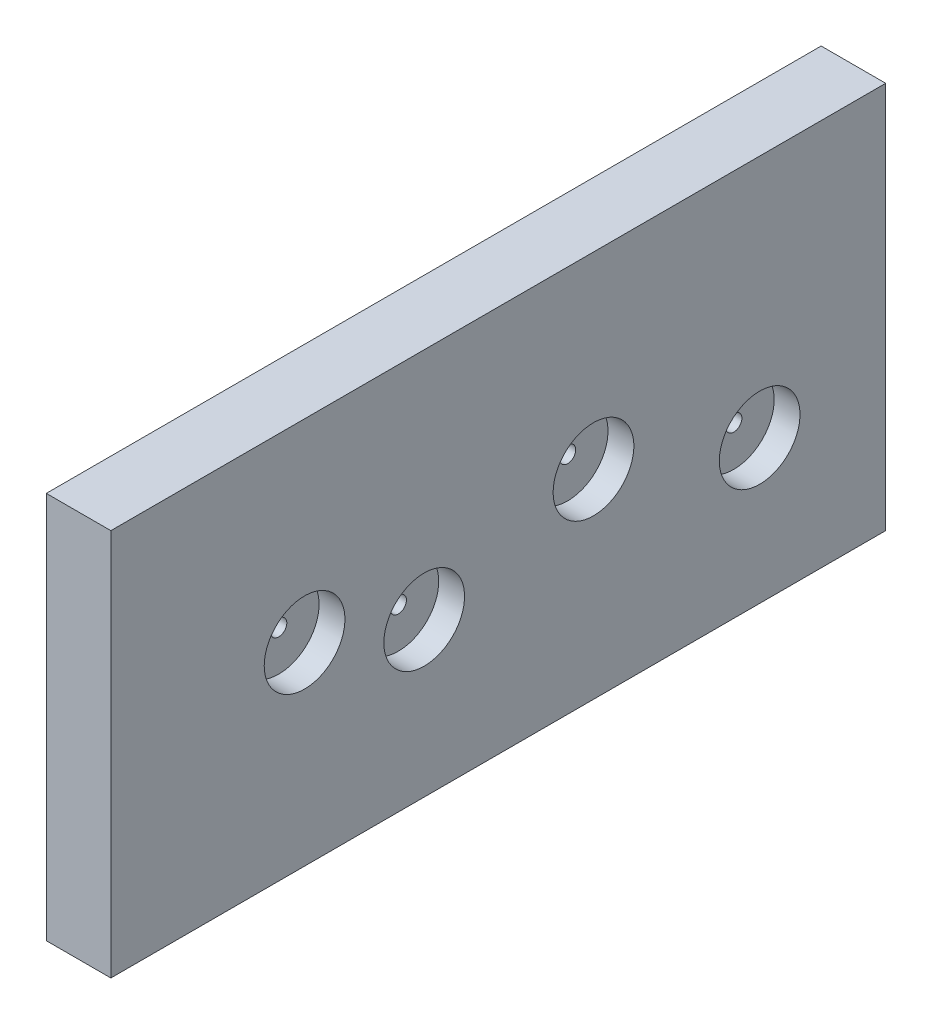
ISO-10303-21;
HEADER;
FILE_DESCRIPTION(('STEP AP214'),'2;1');
FILE_NAME('part.step','',(''),(''),'','','');
FILE_SCHEMA(('AUTOMOTIVE_DESIGN { 1 0 10303 214 1 1 1 1 }'));
ENDSEC;
DATA;
#1=APPLICATION_CONTEXT('core data for automotive mechanical design processes');
#2=APPLICATION_PROTOCOL_DEFINITION('international standard','automotive_design',2000,#1);
#3=PRODUCT_CONTEXT('',#1,'mechanical');
#4=PRODUCT('Part','Part','',(#3));
#5=PRODUCT_RELATED_PRODUCT_CATEGORY('part','',(#4));
#6=PRODUCT_DEFINITION_FORMATION('','',#4);
#7=PRODUCT_DEFINITION_CONTEXT('part definition',#1,'design');
#8=PRODUCT_DEFINITION('design','',#6,#7);
#9=PRODUCT_DEFINITION_SHAPE('','',#8);
#10=(LENGTH_UNIT() NAMED_UNIT(*) SI_UNIT(.MILLI.,.METRE.));
#11=(NAMED_UNIT(*) PLANE_ANGLE_UNIT() SI_UNIT($,.RADIAN.));
#12=(NAMED_UNIT(*) SI_UNIT($,.STERADIAN.) SOLID_ANGLE_UNIT());
#13=UNCERTAINTY_MEASURE_WITH_UNIT(LENGTH_MEASURE(1.E-05),#10,'distance_accuracy_value','');
#14=(GEOMETRIC_REPRESENTATION_CONTEXT(3) GLOBAL_UNCERTAINTY_ASSIGNED_CONTEXT((#13)) GLOBAL_UNIT_ASSIGNED_CONTEXT((#10,
#11,#12)) REPRESENTATION_CONTEXT('',''));
#15=CARTESIAN_POINT('',(0.,0.,0.));
#16=DIRECTION('',(0.,0.,1.));
#17=DIRECTION('',(1.,0.,0.));
#18=AXIS2_PLACEMENT_3D('',#15,#16,#17);
#19=CARTESIAN_POINT('',(12.7,-38.1,0.));
#20=DIRECTION('',(0.,1.,0.));
#21=DIRECTION('',(0.,0.,1.));
#22=AXIS2_PLACEMENT_3D('',#19,#20,#21);
#23=PLANE('',#22);
#24=CARTESIAN_POINT('',(6.35000000000001,-38.1,0.));
#25=DIRECTION('',(0.,-1.,0.));
#26=DIRECTION('',(0.,0.,-1.));
#27=AXIS2_PLACEMENT_3D('',#24,#25,#26);
#28=CIRCLE('',#27,3.175);
#29=CARTESIAN_POINT('',(6.35000000000001,-38.1,-3.175));
#30=VERTEX_POINT('',#29);
#31=EDGE_CURVE('E115',#30,#30,#28,.T.);
#32=ORIENTED_EDGE('',*,*,#31,.F.);
#33=EDGE_LOOP('',(#32));
#34=FACE_BOUND('',#33,.T.);
#35=CARTESIAN_POINT('',(6.35,-38.1,57.15));
#36=DIRECTION('',(0.,-1.,0.));
#37=DIRECTION('',(0.,0.,-1.));
#38=AXIS2_PLACEMENT_3D('',#35,#36,#37);
#39=CIRCLE('',#38,3.175);
#40=CARTESIAN_POINT('',(6.35,-38.1,53.975));
#41=VERTEX_POINT('',#40);
#42=EDGE_CURVE('E114',#41,#41,#39,.T.);
#43=ORIENTED_EDGE('',*,*,#42,.F.);
#44=EDGE_LOOP('',(#43));
#45=FACE_BOUND('',#44,.T.);
#46=DIRECTION('',(0.,0.,-1.));
#47=VECTOR('',#46,1.);
#48=CARTESIAN_POINT('',(0.,-38.1,0.));
#49=LINE('',#48,#47);
#50=CARTESIAN_POINT('',(0.,-38.1,76.2));
#51=VERTEX_POINT('',#50);
#52=CARTESIAN_POINT('',(0.,-38.1,-76.2));
#53=VERTEX_POINT('',#52);
#54=EDGE_CURVE('E182',#51,#53,#49,.T.);
#55=ORIENTED_EDGE('',*,*,#54,.T.);
#56=DIRECTION('',(-1.,0.,0.));
#57=VECTOR('',#56,1.);
#58=CARTESIAN_POINT('',(12.7,-38.1,-76.2));
#59=LINE('',#58,#57);
#60=CARTESIAN_POINT('',(12.7,-38.1,-76.2));
#61=VERTEX_POINT('',#60);
#62=EDGE_CURVE('E11',#61,#53,#59,.T.);
#63=ORIENTED_EDGE('',*,*,#62,.F.);
#64=DIRECTION('',(0.,0.,-1.));
#65=VECTOR('',#64,1.);
#66=CARTESIAN_POINT('',(12.7,-38.1,0.));
#67=LINE('',#66,#65);
#68=CARTESIAN_POINT('',(12.7,-38.1,76.2));
#69=VERTEX_POINT('',#68);
#70=EDGE_CURVE('E169',#69,#61,#67,.T.);
#71=ORIENTED_EDGE('',*,*,#70,.F.);
#72=DIRECTION('',(-1.,0.,0.));
#73=VECTOR('',#72,1.);
#74=CARTESIAN_POINT('',(12.7,-38.1,76.2));
#75=LINE('',#74,#73);
#76=EDGE_CURVE('E66',#69,#51,#75,.T.);
#77=ORIENTED_EDGE('',*,*,#76,.T.);
#78=EDGE_LOOP('',(#55,#63,#71,#77));
#79=FACE_BOUND('',#78,.T.);
#80=CARTESIAN_POINT('',(6.35000000000002,-38.1,-63.5));
#81=DIRECTION('',(0.,-1.,0.));
#82=DIRECTION('',(0.,0.,-1.));
#83=AXIS2_PLACEMENT_3D('',#80,#81,#82);
#84=CIRCLE('',#83,3.175);
#85=CARTESIAN_POINT('',(6.35000000000002,-38.1,-66.675));
#86=VERTEX_POINT('',#85);
#87=EDGE_CURVE('E128',#86,#86,#84,.T.);
#88=ORIENTED_EDGE('',*,*,#87,.F.);
#89=EDGE_LOOP('',(#88));
#90=FACE_BOUND('',#89,.T.);
#91=ADVANCED_FACE('F47',(#34,#45,#79,#90),#23,.F.);
#92=CARTESIAN_POINT('',(12.7,0.,-76.2));
#93=DIRECTION('',(0.,0.,1.));
#94=DIRECTION('',(1.,0.,0.));
#95=AXIS2_PLACEMENT_3D('',#92,#93,#94);
#96=PLANE('',#95);
#97=DIRECTION('',(0.,1.,0.));
#98=VECTOR('',#97,1.);
#99=CARTESIAN_POINT('',(0.,0.,-76.2));
#100=LINE('',#99,#98);
#101=CARTESIAN_POINT('',(0.,38.1,-76.2));
#102=VERTEX_POINT('',#101);
#103=EDGE_CURVE('E185',#53,#102,#100,.T.);
#104=ORIENTED_EDGE('',*,*,#103,.T.);
#105=DIRECTION('',(-1.,0.,0.));
#106=VECTOR('',#105,1.);
#107=CARTESIAN_POINT('',(12.7,38.1,-76.2));
#108=LINE('',#107,#106);
#109=CARTESIAN_POINT('',(12.7,38.1,-76.2));
#110=VERTEX_POINT('',#109);
#111=EDGE_CURVE('E57',#110,#102,#108,.T.);
#112=ORIENTED_EDGE('',*,*,#111,.F.);
#113=DIRECTION('',(0.,1.,0.));
#114=VECTOR('',#113,1.);
#115=CARTESIAN_POINT('',(12.7,0.,-76.2));
#116=LINE('',#115,#114);
#117=EDGE_CURVE('E92',#61,#110,#116,.T.);
#118=ORIENTED_EDGE('',*,*,#117,.F.);
#119=ORIENTED_EDGE('',*,*,#62,.T.);
#120=EDGE_LOOP('',(#104,#112,#118,#119));
#121=FACE_BOUND('',#120,.T.);
#122=ADVANCED_FACE('F269',(#121),#96,.F.);
#123=CARTESIAN_POINT('',(12.7,38.1,0.));
#124=DIRECTION('',(0.,1.,0.));
#125=DIRECTION('',(0.,0.,1.));
#126=AXIS2_PLACEMENT_3D('',#123,#124,#125);
#127=PLANE('',#126);
#128=DIRECTION('',(0.,0.,-1.));
#129=VECTOR('',#128,1.);
#130=CARTESIAN_POINT('',(0.,38.1,0.));
#131=LINE('',#130,#129);
#132=CARTESIAN_POINT('',(0.,38.1,76.2));
#133=VERTEX_POINT('',#132);
#134=EDGE_CURVE('E189',#133,#102,#131,.T.);
#135=ORIENTED_EDGE('',*,*,#134,.F.);
#136=DIRECTION('',(-1.,0.,0.));
#137=VECTOR('',#136,1.);
#138=CARTESIAN_POINT('',(12.7,38.1,76.2));
#139=LINE('',#138,#137);
#140=CARTESIAN_POINT('',(12.7,38.1,76.2));
#141=VERTEX_POINT('',#140);
#142=EDGE_CURVE('E81',#141,#133,#139,.T.);
#143=ORIENTED_EDGE('',*,*,#142,.F.);
#144=DIRECTION('',(0.,0.,-1.));
#145=VECTOR('',#144,1.);
#146=CARTESIAN_POINT('',(12.7,38.1,0.));
#147=LINE('',#146,#145);
#148=EDGE_CURVE('E175',#141,#110,#147,.T.);
#149=ORIENTED_EDGE('',*,*,#148,.T.);
#150=ORIENTED_EDGE('',*,*,#111,.T.);
#151=EDGE_LOOP('',(#135,#143,#149,#150));
#152=FACE_BOUND('',#151,.T.);
#153=ADVANCED_FACE('F240',(#152),#127,.T.);
#154=CARTESIAN_POINT('',(12.7,-9.873506971,-51.4082559918149));
#155=DIRECTION('',(-1.,0.,0.));
#156=DIRECTION('',(0.,0.,1.));
#157=AXIS2_PLACEMENT_3D('',#154,#155,#156);
#158=CYLINDRICAL_SURFACE('',#157,1.5875);
#159=CARTESIAN_POINT('',(7.62,-9.873506971,-51.4082559918149));
#160=DIRECTION('',(-1.,0.,0.));
#161=DIRECTION('',(0.,0.,1.));
#162=AXIS2_PLACEMENT_3D('',#159,#160,#161);
#163=CIRCLE('',#162,1.5875);
#164=CARTESIAN_POINT('',(7.62,-9.873506971,-49.8207559918149));
#165=VERTEX_POINT('',#164);
#166=EDGE_CURVE('E50',#165,#165,#163,.T.);
#167=ORIENTED_EDGE('',*,*,#166,.F.);
#168=EDGE_LOOP('',(#167));
#169=FACE_BOUND('',#168,.T.);
#170=CARTESIAN_POINT('',(0.,-9.873506971,-51.4082559918149));
#171=DIRECTION('',(1.,0.,0.));
#172=DIRECTION('',(0.,0.,-1.));
#173=AXIS2_PLACEMENT_3D('',#170,#171,#172);
#174=CIRCLE('',#173,1.5875);
#175=CARTESIAN_POINT('',(0.,-9.873506971,-52.9957559918149));
#176=VERTEX_POINT('',#175);
#177=EDGE_CURVE('E205',#176,#176,#174,.T.);
#178=ORIENTED_EDGE('',*,*,#177,.F.);
#179=EDGE_LOOP('',(#178));
#180=FACE_BOUND('',#179,.T.);
#181=ADVANCED_FACE('F236',(#169,#180),#158,.F.);
#182=CARTESIAN_POINT('',(12.7,1.096077429,-18.7225315801618));
#183=DIRECTION('',(-1.,0.,0.));
#184=DIRECTION('',(0.,0.,1.));
#185=AXIS2_PLACEMENT_3D('',#182,#183,#184);
#186=CYLINDRICAL_SURFACE('',#185,1.5875);
#187=CARTESIAN_POINT('',(7.62,1.096077429,-18.7225315801618));
#188=DIRECTION('',(-1.,0.,0.));
#189=DIRECTION('',(0.,0.,1.));
#190=AXIS2_PLACEMENT_3D('',#187,#188,#189);
#191=CIRCLE('',#190,1.5875);
#192=CARTESIAN_POINT('',(7.62,1.096077429,-17.1350315801618));
#193=VERTEX_POINT('',#192);
#194=EDGE_CURVE('E224',#193,#193,#191,.T.);
#195=ORIENTED_EDGE('',*,*,#194,.F.);
#196=EDGE_LOOP('',(#195));
#197=FACE_BOUND('',#196,.T.);
#198=CARTESIAN_POINT('',(0.,1.096077429,-18.7225315801618));
#199=DIRECTION('',(1.,0.,0.));
#200=DIRECTION('',(0.,0.,-1.));
#201=AXIS2_PLACEMENT_3D('',#198,#199,#200);
#202=CIRCLE('',#201,1.5875);
#203=CARTESIAN_POINT('',(0.,1.096077429,-20.3100315801618));
#204=VERTEX_POINT('',#203);
#205=EDGE_CURVE('E201',#204,#204,#202,.T.);
#206=ORIENTED_EDGE('',*,*,#205,.F.);
#207=EDGE_LOOP('',(#206));
#208=FACE_BOUND('',#207,.T.);
#209=ADVANCED_FACE('F239',(#197,#208),#186,.F.);
#210=CARTESIAN_POINT('',(12.7,0.,38.1));
#211=DIRECTION('',(-1.,0.,0.));
#212=DIRECTION('',(0.,0.,1.));
#213=AXIS2_PLACEMENT_3D('',#210,#211,#212);
#214=CYLINDRICAL_SURFACE('',#213,1.5875);
#215=CARTESIAN_POINT('',(7.62,0.,38.1));
#216=DIRECTION('',(-1.,0.,0.));
#217=DIRECTION('',(0.,0.,1.));
#218=AXIS2_PLACEMENT_3D('',#215,#216,#217);
#219=CIRCLE('',#218,1.5875);
#220=CARTESIAN_POINT('',(7.62,0.,39.6875));
#221=VERTEX_POINT('',#220);
#222=EDGE_CURVE('E221',#221,#221,#219,.T.);
#223=ORIENTED_EDGE('',*,*,#222,.F.);
#224=EDGE_LOOP('',(#223));
#225=FACE_BOUND('',#224,.T.);
#226=CARTESIAN_POINT('',(0.,0.,38.1));
#227=DIRECTION('',(1.,0.,0.));
#228=DIRECTION('',(0.,0.,-1.));
#229=AXIS2_PLACEMENT_3D('',#226,#227,#228);
#230=CIRCLE('',#229,1.5875);
#231=CARTESIAN_POINT('',(0.,0.,36.5125));
#232=VERTEX_POINT('',#231);
#233=EDGE_CURVE('E197',#232,#232,#230,.T.);
#234=ORIENTED_EDGE('',*,*,#233,.F.);
#235=EDGE_LOOP('',(#234));
#236=FACE_BOUND('',#235,.T.);
#237=ADVANCED_FACE('F265',(#225,#236),#214,.F.);
#238=CARTESIAN_POINT('',(12.7,0.,76.2));
#239=DIRECTION('',(0.,0.,1.));
#240=DIRECTION('',(1.,0.,0.));
#241=AXIS2_PLACEMENT_3D('',#238,#239,#240);
#242=PLANE('',#241);
#243=DIRECTION('',(0.,1.,0.));
#244=VECTOR('',#243,1.);
#245=CARTESIAN_POINT('',(0.,0.,76.2));
#246=LINE('',#245,#244);
#247=EDGE_CURVE('E193',#51,#133,#246,.T.);
#248=ORIENTED_EDGE('',*,*,#247,.F.);
#249=ORIENTED_EDGE('',*,*,#76,.F.);
#250=DIRECTION('',(0.,1.,0.));
#251=VECTOR('',#250,1.);
#252=CARTESIAN_POINT('',(12.7,0.,76.2));
#253=LINE('',#252,#251);
#254=EDGE_CURVE('E179',#69,#141,#253,.T.);
#255=ORIENTED_EDGE('',*,*,#254,.T.);
#256=ORIENTED_EDGE('',*,*,#142,.T.);
#257=EDGE_LOOP('',(#248,#249,#255,#256));
#258=FACE_BOUND('',#257,.T.);
#259=ADVANCED_FACE('F255',(#258),#242,.T.);
#260=CARTESIAN_POINT('',(12.7,-7.860160654,14.5712240149026));
#261=DIRECTION('',(-1.,0.,0.));
#262=DIRECTION('',(0.,0.,1.));
#263=AXIS2_PLACEMENT_3D('',#260,#261,#262);
#264=CYLINDRICAL_SURFACE('',#263,1.5875);
#265=CARTESIAN_POINT('',(7.62,-7.860160654,14.5712240149026));
#266=DIRECTION('',(-1.,0.,0.));
#267=DIRECTION('',(0.,0.,1.));
#268=AXIS2_PLACEMENT_3D('',#265,#266,#267);
#269=CIRCLE('',#268,1.5875);
#270=CARTESIAN_POINT('',(7.62,-7.860160654,16.1587240149026));
#271=VERTEX_POINT('',#270);
#272=EDGE_CURVE('E141',#271,#271,#269,.T.);
#273=ORIENTED_EDGE('',*,*,#272,.F.);
#274=EDGE_LOOP('',(#273));
#275=FACE_BOUND('',#274,.T.);
#276=CARTESIAN_POINT('',(0.,-7.860160654,14.5712240149026));
#277=DIRECTION('',(1.,0.,0.));
#278=DIRECTION('',(0.,0.,-1.));
#279=AXIS2_PLACEMENT_3D('',#276,#277,#278);
#280=CIRCLE('',#279,1.5875);
#281=CARTESIAN_POINT('',(0.,-7.860160654,12.9837240149026));
#282=VERTEX_POINT('',#281);
#283=EDGE_CURVE('E172',#282,#282,#280,.T.);
#284=ORIENTED_EDGE('',*,*,#283,.F.);
#285=EDGE_LOOP('',(#284));
#286=FACE_BOUND('',#285,.T.);
#287=ADVANCED_FACE('F253',(#275,#286),#264,.F.);
#288=CARTESIAN_POINT('',(12.7,0.,0.));
#289=DIRECTION('',(1.,0.,0.));
#290=DIRECTION('',(0.,0.,-1.));
#291=AXIS2_PLACEMENT_3D('',#288,#289,#290);
#292=PLANE('',#291);
#293=CARTESIAN_POINT('',(12.7,0.,38.1));
#294=DIRECTION('',(-1.,0.,0.));
#295=DIRECTION('',(0.,0.,1.));
#296=AXIS2_PLACEMENT_3D('',#293,#294,#295);
#297=CIRCLE('',#296,7.9375);
#298=CARTESIAN_POINT('',(12.7,0.,46.0375));
#299=VERTEX_POINT('',#298);
#300=EDGE_CURVE('E142',#299,#299,#297,.T.);
#301=ORIENTED_EDGE('',*,*,#300,.T.);
#302=EDGE_LOOP('',(#301));
#303=FACE_BOUND('',#302,.T.);
#304=CARTESIAN_POINT('',(12.7,-7.860160654,14.5712240149026));
#305=DIRECTION('',(-1.,0.,0.));
#306=DIRECTION('',(0.,0.,1.));
#307=AXIS2_PLACEMENT_3D('',#304,#305,#306);
#308=CIRCLE('',#307,7.9375);
#309=CARTESIAN_POINT('',(12.7,-7.860160654,22.5087240149026));
#310=VERTEX_POINT('',#309);
#311=EDGE_CURVE('E146',#310,#310,#308,.T.);
#312=ORIENTED_EDGE('',*,*,#311,.T.);
#313=EDGE_LOOP('',(#312));
#314=FACE_BOUND('',#313,.T.);
#315=CARTESIAN_POINT('',(12.7,1.096077429,-18.7225315801618));
#316=DIRECTION('',(-1.,0.,0.));
#317=DIRECTION('',(0.,0.,1.));
#318=AXIS2_PLACEMENT_3D('',#315,#316,#317);
#319=CIRCLE('',#318,7.9375);
#320=CARTESIAN_POINT('',(12.7,1.096077429,-10.7850315801618));
#321=VERTEX_POINT('',#320);
#322=EDGE_CURVE('E154',#321,#321,#319,.T.);
#323=ORIENTED_EDGE('',*,*,#322,.T.);
#324=EDGE_LOOP('',(#323));
#325=FACE_BOUND('',#324,.T.);
#326=CARTESIAN_POINT('',(12.7,-9.873506971,-51.4082559918149));
#327=DIRECTION('',(-1.,0.,0.));
#328=DIRECTION('',(0.,0.,1.));
#329=AXIS2_PLACEMENT_3D('',#326,#327,#328);
#330=CIRCLE('',#329,7.9375);
#331=CARTESIAN_POINT('',(12.7,-9.873506971,-43.4707559918149));
#332=VERTEX_POINT('',#331);
#333=EDGE_CURVE('E162',#332,#332,#330,.T.);
#334=ORIENTED_EDGE('',*,*,#333,.T.);
#335=EDGE_LOOP('',(#334));
#336=FACE_BOUND('',#335,.T.);
#337=ORIENTED_EDGE('',*,*,#70,.T.);
#338=ORIENTED_EDGE('',*,*,#117,.T.);
#339=ORIENTED_EDGE('',*,*,#148,.F.);
#340=ORIENTED_EDGE('',*,*,#254,.F.);
#341=EDGE_LOOP('',(#337,#338,#339,#340));
#342=FACE_BOUND('',#341,.T.);
#343=ADVANCED_FACE('F248',(#303,#314,#325,#336,#342),#292,.T.);
#344=CARTESIAN_POINT('',(0.,0.,0.));
#345=DIRECTION('',(1.,0.,0.));
#346=DIRECTION('',(0.,0.,-1.));
#347=AXIS2_PLACEMENT_3D('',#344,#345,#346);
#348=PLANE('',#347);
#349=ORIENTED_EDGE('',*,*,#54,.F.);
#350=ORIENTED_EDGE('',*,*,#247,.T.);
#351=ORIENTED_EDGE('',*,*,#134,.T.);
#352=ORIENTED_EDGE('',*,*,#103,.F.);
#353=EDGE_LOOP('',(#349,#350,#351,#352));
#354=FACE_BOUND('',#353,.T.);
#355=ORIENTED_EDGE('',*,*,#233,.T.);
#356=EDGE_LOOP('',(#355));
#357=FACE_BOUND('',#356,.T.);
#358=ORIENTED_EDGE('',*,*,#205,.T.);
#359=EDGE_LOOP('',(#358));
#360=FACE_BOUND('',#359,.T.);
#361=ORIENTED_EDGE('',*,*,#177,.T.);
#362=EDGE_LOOP('',(#361));
#363=FACE_BOUND('',#362,.T.);
#364=ORIENTED_EDGE('',*,*,#283,.T.);
#365=EDGE_LOOP('',(#364));
#366=FACE_BOUND('',#365,.T.);
#367=ADVANCED_FACE('F244',(#354,#357,#360,#363,#366),#348,.F.);
#368=CARTESIAN_POINT('',(7.62,-9.873506971,-51.4082559918149));
#369=DIRECTION('',(1.,0.,0.));
#370=DIRECTION('',(0.,0.,-1.));
#371=AXIS2_PLACEMENT_3D('',#368,#369,#370);
#372=CYLINDRICAL_SURFACE('',#371,7.9375);
#373=CARTESIAN_POINT('',(7.62,-9.873506971,-51.4082559918149));
#374=DIRECTION('',(-1.,0.,0.));
#375=DIRECTION('',(0.,0.,1.));
#376=AXIS2_PLACEMENT_3D('',#373,#374,#375);
#377=CIRCLE('',#376,7.9375);
#378=CARTESIAN_POINT('',(7.62,-9.873506971,-43.4707559918149));
#379=VERTEX_POINT('',#378);
#380=EDGE_CURVE('E136',#379,#379,#377,.T.);
#381=ORIENTED_EDGE('',*,*,#380,.T.);
#382=EDGE_LOOP('',(#381));
#383=FACE_BOUND('',#382,.T.);
#384=ORIENTED_EDGE('',*,*,#333,.F.);
#385=EDGE_LOOP('',(#384));
#386=FACE_BOUND('',#385,.T.);
#387=ADVANCED_FACE('F247',(#383,#386),#372,.F.);
#388=CARTESIAN_POINT('',(7.62,-9.873506971,-51.4082559918149));
#389=DIRECTION('',(-1.,0.,0.));
#390=DIRECTION('',(0.,0.,1.));
#391=AXIS2_PLACEMENT_3D('',#388,#389,#390);
#392=PLANE('',#391);
#393=ORIENTED_EDGE('',*,*,#166,.T.);
#394=EDGE_LOOP('',(#393));
#395=FACE_BOUND('',#394,.T.);
#396=ORIENTED_EDGE('',*,*,#380,.F.);
#397=EDGE_LOOP('',(#396));
#398=FACE_BOUND('',#397,.T.);
#399=ADVANCED_FACE('F233',(#395,#398),#392,.F.);
#400=CARTESIAN_POINT('',(7.62,1.096077429,-18.7225315801618));
#401=DIRECTION('',(1.,0.,0.));
#402=DIRECTION('',(0.,0.,-1.));
#403=AXIS2_PLACEMENT_3D('',#400,#401,#402);
#404=CYLINDRICAL_SURFACE('',#403,7.9375);
#405=CARTESIAN_POINT('',(7.62,1.096077429,-18.7225315801618));
#406=DIRECTION('',(-1.,0.,0.));
#407=DIRECTION('',(0.,0.,1.));
#408=AXIS2_PLACEMENT_3D('',#405,#406,#407);
#409=CIRCLE('',#408,7.9375);
#410=CARTESIAN_POINT('',(7.62,1.096077429,-10.7850315801618));
#411=VERTEX_POINT('',#410);
#412=EDGE_CURVE('E158',#411,#411,#409,.T.);
#413=ORIENTED_EDGE('',*,*,#412,.T.);
#414=EDGE_LOOP('',(#413));
#415=FACE_BOUND('',#414,.T.);
#416=ORIENTED_EDGE('',*,*,#322,.F.);
#417=EDGE_LOOP('',(#416));
#418=FACE_BOUND('',#417,.T.);
#419=ADVANCED_FACE('F315',(#415,#418),#404,.F.);
#420=CARTESIAN_POINT('',(7.62,1.096077429,-18.7225315801618));
#421=DIRECTION('',(-1.,0.,0.));
#422=DIRECTION('',(0.,0.,1.));
#423=AXIS2_PLACEMENT_3D('',#420,#421,#422);
#424=PLANE('',#423);
#425=ORIENTED_EDGE('',*,*,#194,.T.);
#426=EDGE_LOOP('',(#425));
#427=FACE_BOUND('',#426,.T.);
#428=ORIENTED_EDGE('',*,*,#412,.F.);
#429=EDGE_LOOP('',(#428));
#430=FACE_BOUND('',#429,.T.);
#431=ADVANCED_FACE('F310',(#427,#430),#424,.F.);
#432=CARTESIAN_POINT('',(7.62,-7.860160654,14.5712240149026));
#433=DIRECTION('',(1.,0.,0.));
#434=DIRECTION('',(0.,0.,-1.));
#435=AXIS2_PLACEMENT_3D('',#432,#433,#434);
#436=CYLINDRICAL_SURFACE('',#435,7.9375);
#437=CARTESIAN_POINT('',(7.62,-7.860160654,14.5712240149026));
#438=DIRECTION('',(-1.,0.,0.));
#439=DIRECTION('',(0.,0.,1.));
#440=AXIS2_PLACEMENT_3D('',#437,#438,#439);
#441=CIRCLE('',#440,7.9375);
#442=CARTESIAN_POINT('',(7.62,-7.860160654,22.5087240149026));
#443=VERTEX_POINT('',#442);
#444=EDGE_CURVE('E150',#443,#443,#441,.T.);
#445=ORIENTED_EDGE('',*,*,#444,.T.);
#446=EDGE_LOOP('',(#445));
#447=FACE_BOUND('',#446,.T.);
#448=ORIENTED_EDGE('',*,*,#311,.F.);
#449=EDGE_LOOP('',(#448));
#450=FACE_BOUND('',#449,.T.);
#451=ADVANCED_FACE('F307',(#447,#450),#436,.F.);
#452=CARTESIAN_POINT('',(7.62,-7.860160654,14.5712240149026));
#453=DIRECTION('',(-1.,0.,0.));
#454=DIRECTION('',(0.,0.,1.));
#455=AXIS2_PLACEMENT_3D('',#452,#453,#454);
#456=PLANE('',#455);
#457=ORIENTED_EDGE('',*,*,#272,.T.);
#458=EDGE_LOOP('',(#457));
#459=FACE_BOUND('',#458,.T.);
#460=ORIENTED_EDGE('',*,*,#444,.F.);
#461=EDGE_LOOP('',(#460));
#462=FACE_BOUND('',#461,.T.);
#463=ADVANCED_FACE('F305',(#459,#462),#456,.F.);
#464=CARTESIAN_POINT('',(7.62,0.,38.1));
#465=DIRECTION('',(1.,0.,0.));
#466=DIRECTION('',(0.,0.,-1.));
#467=AXIS2_PLACEMENT_3D('',#464,#465,#466);
#468=CYLINDRICAL_SURFACE('',#467,7.9375);
#469=CARTESIAN_POINT('',(7.62,0.,38.1));
#470=DIRECTION('',(-1.,0.,0.));
#471=DIRECTION('',(0.,0.,1.));
#472=AXIS2_PLACEMENT_3D('',#469,#470,#471);
#473=CIRCLE('',#472,7.9375);
#474=CARTESIAN_POINT('',(7.62,0.,46.0375));
#475=VERTEX_POINT('',#474);
#476=EDGE_CURVE('E137',#475,#475,#473,.T.);
#477=ORIENTED_EDGE('',*,*,#476,.T.);
#478=EDGE_LOOP('',(#477));
#479=FACE_BOUND('',#478,.T.);
#480=ORIENTED_EDGE('',*,*,#300,.F.);
#481=EDGE_LOOP('',(#480));
#482=FACE_BOUND('',#481,.T.);
#483=ADVANCED_FACE('F301',(#479,#482),#468,.F.);
#484=CARTESIAN_POINT('',(7.62,0.,38.1));
#485=DIRECTION('',(-1.,0.,0.));
#486=DIRECTION('',(0.,0.,1.));
#487=AXIS2_PLACEMENT_3D('',#484,#485,#486);
#488=PLANE('',#487);
#489=ORIENTED_EDGE('',*,*,#222,.T.);
#490=EDGE_LOOP('',(#489));
#491=FACE_BOUND('',#490,.T.);
#492=ORIENTED_EDGE('',*,*,#476,.F.);
#493=EDGE_LOOP('',(#492));
#494=FACE_BOUND('',#493,.T.);
#495=ADVANCED_FACE('F294',(#491,#494),#488,.F.);
#496=CARTESIAN_POINT('',(6.35000000000002,0.,-63.5));
#497=DIRECTION('',(0.,-1.,0.));
#498=DIRECTION('',(0.,0.,-1.));
#499=AXIS2_PLACEMENT_3D('',#496,#497,#498);
#500=CONICAL_SURFACE('',#499,3.17499999999999,1.02974425867665);
#501=CARTESIAN_POINT('',(6.35000000000001,1.9077324654125,-63.5));
#502=VERTEX_POINT('',#501);
#503=VERTEX_LOOP('',#502);
#504=FACE_BOUND('',#503,.T.);
#505=CARTESIAN_POINT('',(6.35000000000002,0.,-63.5));
#506=DIRECTION('',(0.,-1.,0.));
#507=DIRECTION('',(0.,0.,-1.));
#508=AXIS2_PLACEMENT_3D('',#505,#506,#507);
#509=CIRCLE('',#508,3.17499999999999);
#510=CARTESIAN_POINT('',(6.35000000000002,0.,-66.675));
#511=VERTEX_POINT('',#510);
#512=EDGE_CURVE('E132',#511,#511,#509,.T.);
#513=ORIENTED_EDGE('',*,*,#512,.T.);
#514=EDGE_LOOP('',(#513));
#515=FACE_BOUND('',#514,.T.);
#516=ADVANCED_FACE('F286',(#504,#515),#500,.F.);
#517=CARTESIAN_POINT('',(6.35000000000002,-38.1,-63.5));
#518=DIRECTION('',(0.,-1.,0.));
#519=DIRECTION('',(0.,0.,-1.));
#520=AXIS2_PLACEMENT_3D('',#517,#518,#519);
#521=CYLINDRICAL_SURFACE('',#520,3.17499999999999);
#522=ORIENTED_EDGE('',*,*,#512,.F.);
#523=EDGE_LOOP('',(#522));
#524=FACE_BOUND('',#523,.T.);
#525=ORIENTED_EDGE('',*,*,#87,.T.);
#526=EDGE_LOOP('',(#525));
#527=FACE_BOUND('',#526,.T.);
#528=ADVANCED_FACE('F283',(#524,#527),#521,.F.);
#529=CARTESIAN_POINT('',(6.35,0.,57.15));
#530=DIRECTION('',(0.,-1.,0.));
#531=DIRECTION('',(0.,0.,-1.));
#532=AXIS2_PLACEMENT_3D('',#529,#530,#531);
#533=CONICAL_SURFACE('',#532,3.17499999999999,1.02974425867665);
#534=CARTESIAN_POINT('',(6.34999999999999,1.9077324654125,57.15));
#535=VERTEX_POINT('',#534);
#536=VERTEX_LOOP('',#535);
#537=FACE_BOUND('',#536,.T.);
#538=CARTESIAN_POINT('',(6.35,0.,57.15));
#539=DIRECTION('',(0.,-1.,0.));
#540=DIRECTION('',(0.,0.,-1.));
#541=AXIS2_PLACEMENT_3D('',#538,#539,#540);
#542=CIRCLE('',#541,3.17499999999999);
#543=CARTESIAN_POINT('',(6.35,0.,53.975));
#544=VERTEX_POINT('',#543);
#545=EDGE_CURVE('E120',#544,#544,#542,.T.);
#546=ORIENTED_EDGE('',*,*,#545,.T.);
#547=EDGE_LOOP('',(#546));
#548=FACE_BOUND('',#547,.T.);
#549=ADVANCED_FACE('F285',(#537,#548),#533,.F.);
#550=CARTESIAN_POINT('',(6.35,-38.1,57.15));
#551=DIRECTION('',(0.,-1.,0.));
#552=DIRECTION('',(0.,0.,-1.));
#553=AXIS2_PLACEMENT_3D('',#550,#551,#552);
#554=CYLINDRICAL_SURFACE('',#553,3.175);
#555=ORIENTED_EDGE('',*,*,#545,.F.);
#556=EDGE_LOOP('',(#555));
#557=FACE_BOUND('',#556,.T.);
#558=ORIENTED_EDGE('',*,*,#42,.T.);
#559=EDGE_LOOP('',(#558));
#560=FACE_BOUND('',#559,.T.);
#561=ADVANCED_FACE('F107',(#557,#560),#554,.F.);
#562=CARTESIAN_POINT('',(6.35000000000001,0.,0.));
#563=DIRECTION('',(0.,-1.,0.));
#564=DIRECTION('',(0.,0.,-1.));
#565=AXIS2_PLACEMENT_3D('',#562,#563,#564);
#566=CONICAL_SURFACE('',#565,3.17499999999999,1.02974425867665);
#567=CARTESIAN_POINT('',(6.35,1.9077324654125,0.));
#568=VERTEX_POINT('',#567);
#569=VERTEX_LOOP('',#568);
#570=FACE_BOUND('',#569,.T.);
#571=CARTESIAN_POINT('',(6.35000000000001,0.,0.));
#572=DIRECTION('',(0.,-1.,0.));
#573=DIRECTION('',(0.,0.,-1.));
#574=AXIS2_PLACEMENT_3D('',#571,#572,#573);
#575=CIRCLE('',#574,3.17499999999999);
#576=CARTESIAN_POINT('',(6.35000000000001,0.,-3.17499999999999));
#577=VERTEX_POINT('',#576);
#578=EDGE_CURVE('E111',#577,#577,#575,.T.);
#579=ORIENTED_EDGE('',*,*,#578,.T.);
#580=EDGE_LOOP('',(#579));
#581=FACE_BOUND('',#580,.T.);
#582=ADVANCED_FACE('F103',(#570,#581),#566,.F.);
#583=CARTESIAN_POINT('',(6.35000000000001,-38.1,0.));
#584=DIRECTION('',(0.,-1.,0.));
#585=DIRECTION('',(0.,0.,-1.));
#586=AXIS2_PLACEMENT_3D('',#583,#584,#585);
#587=CYLINDRICAL_SURFACE('',#586,3.175);
#588=ORIENTED_EDGE('',*,*,#578,.F.);
#589=EDGE_LOOP('',(#588));
#590=FACE_BOUND('',#589,.T.);
#591=ORIENTED_EDGE('',*,*,#31,.T.);
#592=EDGE_LOOP('',(#591));
#593=FACE_BOUND('',#592,.T.);
#594=ADVANCED_FACE('F106',(#590,#593),#587,.F.);
#595=CLOSED_SHELL('',(#91,#122,#153,#181,#209,#237,#259,#287,#343,#367,#387,#399,#419,#431,#451,
#463,#483,#495,#516,#528,#549,#561,#582,#594));
#596=MANIFOLD_SOLID_BREP('B2',#595);
#597=ADVANCED_BREP_SHAPE_REPRESENTATION('',(#18,#596),#14);
#598=SHAPE_DEFINITION_REPRESENTATION(#9,#597);
ENDSEC;
END-ISO-10303-21;
